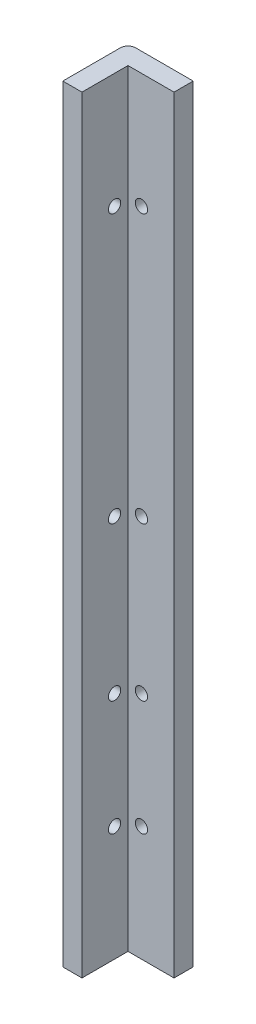
ISO-10303-21;
HEADER;
FILE_DESCRIPTION(('STEP AP214'),'2;1');
FILE_NAME('part.step','',(''),(''),'','','');
FILE_SCHEMA(('AUTOMOTIVE_DESIGN { 1 0 10303 214 1 1 1 1 }'));
ENDSEC;
DATA;
#1=APPLICATION_CONTEXT('core data for automotive mechanical design processes');
#2=APPLICATION_PROTOCOL_DEFINITION('international standard','automotive_design',2000,#1);
#3=PRODUCT_CONTEXT('',#1,'mechanical');
#4=PRODUCT('Part','Part','',(#3));
#5=PRODUCT_RELATED_PRODUCT_CATEGORY('part','',(#4));
#6=PRODUCT_DEFINITION_FORMATION('','',#4);
#7=PRODUCT_DEFINITION_CONTEXT('part definition',#1,'design');
#8=PRODUCT_DEFINITION('design','',#6,#7);
#9=PRODUCT_DEFINITION_SHAPE('','',#8);
#10=(LENGTH_UNIT() NAMED_UNIT(*) SI_UNIT(.MILLI.,.METRE.));
#11=(NAMED_UNIT(*) PLANE_ANGLE_UNIT() SI_UNIT($,.RADIAN.));
#12=(NAMED_UNIT(*) SI_UNIT($,.STERADIAN.) SOLID_ANGLE_UNIT());
#13=UNCERTAINTY_MEASURE_WITH_UNIT(LENGTH_MEASURE(1.E-05),#10,'distance_accuracy_value','');
#14=(GEOMETRIC_REPRESENTATION_CONTEXT(3) GLOBAL_UNCERTAINTY_ASSIGNED_CONTEXT((#13)) GLOBAL_UNIT_ASSIGNED_CONTEXT((#10,
#11,#12)) REPRESENTATION_CONTEXT('',''));
#15=CARTESIAN_POINT('',(0.,0.,0.));
#16=DIRECTION('',(0.,0.,1.));
#17=DIRECTION('',(1.,0.,0.));
#18=AXIS2_PLACEMENT_3D('',#15,#16,#17);
#19=CARTESIAN_POINT('',(0.,100.,0.));
#20=DIRECTION('',(1.,0.,0.));
#21=DIRECTION('',(0.,0.,-1.));
#22=AXIS2_PLACEMENT_3D('',#19,#20,#21);
#23=PLANE('',#22);
#24=CARTESIAN_POINT('',(0.,50.,-4.25));
#25=DIRECTION('',(-1.,0.,0.));
#26=DIRECTION('',(0.,0.,1.));
#27=AXIS2_PLACEMENT_3D('',#24,#25,#26);
#28=CIRCLE('',#27,1.025);
#29=CARTESIAN_POINT('',(0.,50.,-3.225));
#30=VERTEX_POINT('',#29);
#31=EDGE_CURVE('E212',#30,#30,#28,.T.);
#32=ORIENTED_EDGE('',*,*,#31,.F.);
#33=EDGE_LOOP('',(#32));
#34=FACE_BOUND('',#33,.T.);
#35=CARTESIAN_POINT('',(0.,15.,-4.25));
#36=DIRECTION('',(-1.,0.,0.));
#37=DIRECTION('',(0.,0.,1.));
#38=AXIS2_PLACEMENT_3D('',#35,#36,#37);
#39=CIRCLE('',#38,1.025);
#40=CARTESIAN_POINT('',(0.,15.,-3.225));
#41=VERTEX_POINT('',#40);
#42=EDGE_CURVE('E221',#41,#41,#39,.T.);
#43=ORIENTED_EDGE('',*,*,#42,.F.);
#44=EDGE_LOOP('',(#43));
#45=FACE_BOUND('',#44,.T.);
#46=DIRECTION('',(0.,0.,1.));
#47=VECTOR('',#46,1.);
#48=CARTESIAN_POINT('',(0.,0.,0.));
#49=LINE('',#48,#47);
#50=CARTESIAN_POINT('',(0.,0.,-7.49999999999999));
#51=VERTEX_POINT('',#50);
#52=CARTESIAN_POINT('',(0.,0.,0.));
#53=VERTEX_POINT('',#52);
#54=EDGE_CURVE('E92',#51,#53,#49,.T.);
#55=ORIENTED_EDGE('',*,*,#54,.T.);
#56=DIRECTION('',(0.,-1.,0.));
#57=VECTOR('',#56,1.);
#58=CARTESIAN_POINT('',(0.,100.,0.));
#59=LINE('',#58,#57);
#60=CARTESIAN_POINT('',(0.,100.,0.));
#61=VERTEX_POINT('',#60);
#62=EDGE_CURVE('E132',#61,#53,#59,.T.);
#63=ORIENTED_EDGE('',*,*,#62,.F.);
#64=DIRECTION('',(0.,0.,1.));
#65=VECTOR('',#64,1.);
#66=CARTESIAN_POINT('',(0.,100.,0.));
#67=LINE('',#66,#65);
#68=CARTESIAN_POINT('',(0.,100.,-7.49999999999999));
#69=VERTEX_POINT('',#68);
#70=EDGE_CURVE('E60',#69,#61,#67,.T.);
#71=ORIENTED_EDGE('',*,*,#70,.F.);
#72=DIRECTION('',(0.,-1.,0.));
#73=VECTOR('',#72,1.);
#74=CARTESIAN_POINT('',(0.,100.,-7.49999999999999));
#75=LINE('',#74,#73);
#76=EDGE_CURVE('E128',#69,#51,#75,.T.);
#77=ORIENTED_EDGE('',*,*,#76,.T.);
#78=EDGE_LOOP('',(#55,#63,#71,#77));
#79=FACE_BOUND('',#78,.T.);
#80=CARTESIAN_POINT('',(0.,85.,-4.25));
#81=DIRECTION('',(-1.,0.,0.));
#82=DIRECTION('',(0.,0.,1.));
#83=AXIS2_PLACEMENT_3D('',#80,#81,#82);
#84=CIRCLE('',#83,1.025);
#85=CARTESIAN_POINT('',(0.,85.,-3.225));
#86=VERTEX_POINT('',#85);
#87=EDGE_CURVE('E170',#86,#86,#84,.T.);
#88=ORIENTED_EDGE('',*,*,#87,.F.);
#89=EDGE_LOOP('',(#88));
#90=FACE_BOUND('',#89,.T.);
#91=CARTESIAN_POINT('',(0.,30.,-4.25));
#92=DIRECTION('',(-1.,0.,0.));
#93=DIRECTION('',(0.,0.,1.));
#94=AXIS2_PLACEMENT_3D('',#91,#92,#93);
#95=CIRCLE('',#94,1.025);
#96=CARTESIAN_POINT('',(0.,30.,-3.225));
#97=VERTEX_POINT('',#96);
#98=EDGE_CURVE('E193',#97,#97,#95,.T.);
#99=ORIENTED_EDGE('',*,*,#98,.F.);
#100=EDGE_LOOP('',(#99));
#101=FACE_BOUND('',#100,.T.);
#102=ADVANCED_FACE('F43',(#34,#45,#79,#90,#101),#23,.F.);
#103=CARTESIAN_POINT('',(0.,85.,-4.25));
#104=DIRECTION('',(-1.,0.,0.));
#105=DIRECTION('',(0.,0.,1.));
#106=AXIS2_PLACEMENT_3D('',#103,#104,#105);
#107=CONICAL_SURFACE('',#106,1.025,0.78539816339746);
#108=CARTESIAN_POINT('',(0.225000000000003,85.,-4.25));
#109=DIRECTION('',(-1.,0.,0.));
#110=DIRECTION('',(0.,0.,1.));
#111=AXIS2_PLACEMENT_3D('',#108,#109,#110);
#112=CIRCLE('',#111,0.799999999999988);
#113=CARTESIAN_POINT('',(0.225000000000003,85.,-3.45000000000001));
#114=VERTEX_POINT('',#113);
#115=EDGE_CURVE('E11',#114,#114,#112,.T.);
#116=ORIENTED_EDGE('',*,*,#115,.F.);
#117=EDGE_LOOP('',(#116));
#118=FACE_BOUND('',#117,.T.);
#119=ORIENTED_EDGE('',*,*,#87,.T.);
#120=EDGE_LOOP('',(#119));
#121=FACE_BOUND('',#120,.T.);
#122=ADVANCED_FACE('F45',(#118,#121),#107,.F.);
#123=CARTESIAN_POINT('',(0.,85.,-4.25));
#124=DIRECTION('',(-1.,0.,0.));
#125=DIRECTION('',(0.,0.,1.));
#126=AXIS2_PLACEMENT_3D('',#123,#124,#125);
#127=CYLINDRICAL_SURFACE('',#126,0.799999999999993);
#128=CARTESIAN_POINT('',(2.5,85.,-4.25));
#129=DIRECTION('',(-1.,0.,0.));
#130=DIRECTION('',(0.,0.,1.));
#131=AXIS2_PLACEMENT_3D('',#128,#129,#130);
#132=CIRCLE('',#131,0.799999999999993);
#133=CARTESIAN_POINT('',(2.5,85.,-3.45000000000001));
#134=VERTEX_POINT('',#133);
#135=EDGE_CURVE('E52',#134,#134,#132,.T.);
#136=ORIENTED_EDGE('',*,*,#135,.F.);
#137=EDGE_LOOP('',(#136));
#138=FACE_BOUND('',#137,.T.);
#139=ORIENTED_EDGE('',*,*,#115,.T.);
#140=EDGE_LOOP('',(#139));
#141=FACE_BOUND('',#140,.T.);
#142=ADVANCED_FACE('F177',(#138,#141),#127,.F.);
#143=CARTESIAN_POINT('',(4.25,85.,-8.5));
#144=DIRECTION('',(0.,0.,-1.));
#145=DIRECTION('',(-1.,0.,0.));
#146=AXIS2_PLACEMENT_3D('',#143,#144,#145);
#147=CONICAL_SURFACE('',#146,1.025,0.785398163397464);
#148=CARTESIAN_POINT('',(4.25,85.,-8.275));
#149=DIRECTION('',(0.,0.,-1.));
#150=DIRECTION('',(-1.,0.,0.));
#151=AXIS2_PLACEMENT_3D('',#148,#149,#150);
#152=CIRCLE('',#151,0.799999999999988);
#153=CARTESIAN_POINT('',(3.45000000000001,85.,-8.275));
#154=VERTEX_POINT('',#153);
#155=EDGE_CURVE('E167',#154,#154,#152,.T.);
#156=ORIENTED_EDGE('',*,*,#155,.F.);
#157=EDGE_LOOP('',(#156));
#158=FACE_BOUND('',#157,.T.);
#159=CARTESIAN_POINT('',(4.25,85.,-8.5));
#160=DIRECTION('',(0.,0.,-1.));
#161=DIRECTION('',(-1.,0.,0.));
#162=AXIS2_PLACEMENT_3D('',#159,#160,#161);
#163=CIRCLE('',#162,1.025);
#164=CARTESIAN_POINT('',(3.225,85.,-8.5));
#165=VERTEX_POINT('',#164);
#166=EDGE_CURVE('E161',#165,#165,#163,.T.);
#167=ORIENTED_EDGE('',*,*,#166,.T.);
#168=EDGE_LOOP('',(#167));
#169=FACE_BOUND('',#168,.T.);
#170=ADVANCED_FACE('F180',(#158,#169),#147,.F.);
#171=CARTESIAN_POINT('',(4.25,85.,-8.5));
#172=DIRECTION('',(0.,0.,-1.));
#173=DIRECTION('',(-1.,0.,0.));
#174=AXIS2_PLACEMENT_3D('',#171,#172,#173);
#175=CYLINDRICAL_SURFACE('',#174,0.799999999999994);
#176=CARTESIAN_POINT('',(4.25,85.,-6.));
#177=DIRECTION('',(0.,0.,-1.));
#178=DIRECTION('',(-1.,0.,0.));
#179=AXIS2_PLACEMENT_3D('',#176,#177,#178);
#180=CIRCLE('',#179,0.799999999999994);
#181=CARTESIAN_POINT('',(3.45000000000001,85.,-6.));
#182=VERTEX_POINT('',#181);
#183=EDGE_CURVE('E164',#182,#182,#180,.T.);
#184=ORIENTED_EDGE('',*,*,#183,.F.);
#185=EDGE_LOOP('',(#184));
#186=FACE_BOUND('',#185,.T.);
#187=ORIENTED_EDGE('',*,*,#155,.T.);
#188=EDGE_LOOP('',(#187));
#189=FACE_BOUND('',#188,.T.);
#190=ADVANCED_FACE('F280',(#186,#189),#175,.F.);
#191=CARTESIAN_POINT('',(1.00000000000001,100.,-8.5));
#192=DIRECTION('',(0.,0.,1.));
#193=DIRECTION('',(1.,0.,0.));
#194=AXIS2_PLACEMENT_3D('',#191,#192,#193);
#195=PLANE('',#194);
#196=CARTESIAN_POINT('',(4.25,30.,-8.5));
#197=DIRECTION('',(0.,0.,-1.));
#198=DIRECTION('',(-1.,0.,0.));
#199=AXIS2_PLACEMENT_3D('',#196,#197,#198);
#200=CIRCLE('',#199,1.025);
#201=CARTESIAN_POINT('',(3.225,30.,-8.5));
#202=VERTEX_POINT('',#201);
#203=EDGE_CURVE('E203',#202,#202,#200,.T.);
#204=ORIENTED_EDGE('',*,*,#203,.F.);
#205=EDGE_LOOP('',(#204));
#206=FACE_BOUND('',#205,.T.);
#207=CARTESIAN_POINT('',(4.25,50.,-8.5));
#208=DIRECTION('',(0.,0.,-1.));
#209=DIRECTION('',(-1.,0.,0.));
#210=AXIS2_PLACEMENT_3D('',#207,#208,#209);
#211=CIRCLE('',#210,1.025);
#212=CARTESIAN_POINT('',(3.225,50.,-8.5));
#213=VERTEX_POINT('',#212);
#214=EDGE_CURVE('E230',#213,#213,#211,.T.);
#215=ORIENTED_EDGE('',*,*,#214,.F.);
#216=EDGE_LOOP('',(#215));
#217=FACE_BOUND('',#216,.T.);
#218=DIRECTION('',(-1.,0.,0.));
#219=VECTOR('',#218,1.);
#220=CARTESIAN_POINT('',(1.00000000000001,0.,-8.5));
#221=LINE('',#220,#219);
#222=CARTESIAN_POINT('',(8.5,0.,-8.5));
#223=VERTEX_POINT('',#222);
#224=CARTESIAN_POINT('',(1.,0.,-8.5));
#225=VERTEX_POINT('',#224);
#226=EDGE_CURVE('E126',#223,#225,#221,.T.);
#227=ORIENTED_EDGE('',*,*,#226,.T.);
#228=DIRECTION('',(0.,-1.,0.));
#229=VECTOR('',#228,1.);
#230=CARTESIAN_POINT('',(1.,100.,-8.5));
#231=LINE('',#230,#229);
#232=CARTESIAN_POINT('',(1.,100.,-8.5));
#233=VERTEX_POINT('',#232);
#234=EDGE_CURVE('E122',#233,#225,#231,.T.);
#235=ORIENTED_EDGE('',*,*,#234,.F.);
#236=DIRECTION('',(-1.,0.,0.));
#237=VECTOR('',#236,1.);
#238=CARTESIAN_POINT('',(1.00000000000001,100.,-8.5));
#239=LINE('',#238,#237);
#240=CARTESIAN_POINT('',(8.5,100.,-8.5));
#241=VERTEX_POINT('',#240);
#242=EDGE_CURVE('E111',#241,#233,#239,.T.);
#243=ORIENTED_EDGE('',*,*,#242,.F.);
#244=DIRECTION('',(0.,-1.,0.));
#245=VECTOR('',#244,1.);
#246=CARTESIAN_POINT('',(8.5,100.,-8.5));
#247=LINE('',#246,#245);
#248=EDGE_CURVE('E127',#241,#223,#247,.T.);
#249=ORIENTED_EDGE('',*,*,#248,.T.);
#250=EDGE_LOOP('',(#227,#235,#243,#249));
#251=FACE_BOUND('',#250,.T.);
#252=CARTESIAN_POINT('',(4.25,15.,-8.5));
#253=DIRECTION('',(0.,0.,-1.));
#254=DIRECTION('',(-1.,0.,0.));
#255=AXIS2_PLACEMENT_3D('',#252,#253,#254);
#256=CIRCLE('',#255,1.025);
#257=CARTESIAN_POINT('',(3.225,15.,-8.5));
#258=VERTEX_POINT('',#257);
#259=EDGE_CURVE('E239',#258,#258,#256,.T.);
#260=ORIENTED_EDGE('',*,*,#259,.F.);
#261=EDGE_LOOP('',(#260));
#262=FACE_BOUND('',#261,.T.);
#263=ORIENTED_EDGE('',*,*,#166,.F.);
#264=EDGE_LOOP('',(#263));
#265=FACE_BOUND('',#264,.T.);
#266=ADVANCED_FACE('F123',(#206,#217,#251,#262,#265),#195,.F.);
#267=CARTESIAN_POINT('',(2.5,100.,0.));
#268=DIRECTION('',(0.,0.,-1.));
#269=DIRECTION('',(-1.,0.,0.));
#270=AXIS2_PLACEMENT_3D('',#267,#268,#269);
#271=PLANE('',#270);
#272=DIRECTION('',(1.,0.,0.));
#273=VECTOR('',#272,1.);
#274=CARTESIAN_POINT('',(2.5,0.,0.));
#275=LINE('',#274,#273);
#276=CARTESIAN_POINT('',(2.5,0.,0.));
#277=VERTEX_POINT('',#276);
#278=EDGE_CURVE('E136',#53,#277,#275,.T.);
#279=ORIENTED_EDGE('',*,*,#278,.T.);
#280=DIRECTION('',(0.,-1.,0.));
#281=VECTOR('',#280,1.);
#282=CARTESIAN_POINT('',(2.5,100.,0.));
#283=LINE('',#282,#281);
#284=CARTESIAN_POINT('',(2.5,100.,0.));
#285=VERTEX_POINT('',#284);
#286=EDGE_CURVE('E159',#285,#277,#283,.T.);
#287=ORIENTED_EDGE('',*,*,#286,.F.);
#288=DIRECTION('',(1.,0.,0.));
#289=VECTOR('',#288,1.);
#290=CARTESIAN_POINT('',(2.5,100.,0.));
#291=LINE('',#290,#289);
#292=EDGE_CURVE('E149',#61,#285,#291,.T.);
#293=ORIENTED_EDGE('',*,*,#292,.F.);
#294=ORIENTED_EDGE('',*,*,#62,.T.);
#295=EDGE_LOOP('',(#279,#287,#293,#294));
#296=FACE_BOUND('',#295,.T.);
#297=ADVANCED_FACE('F264',(#296),#271,.F.);
#298=CARTESIAN_POINT('',(2.5,100.,-6.));
#299=DIRECTION('',(-1.,0.,0.));
#300=DIRECTION('',(0.,0.,1.));
#301=AXIS2_PLACEMENT_3D('',#298,#299,#300);
#302=PLANE('',#301);
#303=CARTESIAN_POINT('',(2.5,30.,-4.25));
#304=DIRECTION('',(-1.,0.,0.));
#305=DIRECTION('',(0.,0.,1.));
#306=AXIS2_PLACEMENT_3D('',#303,#304,#305);
#307=CIRCLE('',#306,0.799999999999993);
#308=CARTESIAN_POINT('',(2.5,30.,-3.45000000000001));
#309=VERTEX_POINT('',#308);
#310=EDGE_CURVE('E198',#309,#309,#307,.T.);
#311=ORIENTED_EDGE('',*,*,#310,.T.);
#312=EDGE_LOOP('',(#311));
#313=FACE_BOUND('',#312,.T.);
#314=CARTESIAN_POINT('',(2.5,50.,-4.25));
#315=DIRECTION('',(-1.,0.,0.));
#316=DIRECTION('',(0.,0.,1.));
#317=AXIS2_PLACEMENT_3D('',#314,#315,#316);
#318=CIRCLE('',#317,0.799999999999993);
#319=CARTESIAN_POINT('',(2.5,50.,-3.45000000000001));
#320=VERTEX_POINT('',#319);
#321=EDGE_CURVE('E215',#320,#320,#318,.T.);
#322=ORIENTED_EDGE('',*,*,#321,.T.);
#323=EDGE_LOOP('',(#322));
#324=FACE_BOUND('',#323,.T.);
#325=CARTESIAN_POINT('',(2.5,15.,-4.25));
#326=DIRECTION('',(-1.,0.,0.));
#327=DIRECTION('',(0.,0.,1.));
#328=AXIS2_PLACEMENT_3D('',#325,#326,#327);
#329=CIRCLE('',#328,0.799999999999993);
#330=CARTESIAN_POINT('',(2.5,15.,-3.45000000000001));
#331=VERTEX_POINT('',#330);
#332=EDGE_CURVE('E227',#331,#331,#329,.T.);
#333=ORIENTED_EDGE('',*,*,#332,.T.);
#334=EDGE_LOOP('',(#333));
#335=FACE_BOUND('',#334,.T.);
#336=DIRECTION('',(0.,0.,-1.));
#337=VECTOR('',#336,1.);
#338=CARTESIAN_POINT('',(2.5,0.,-6.));
#339=LINE('',#338,#337);
#340=CARTESIAN_POINT('',(2.5,0.,-6.));
#341=VERTEX_POINT('',#340);
#342=EDGE_CURVE('E139',#277,#341,#339,.T.);
#343=ORIENTED_EDGE('',*,*,#342,.T.);
#344=DIRECTION('',(0.,-1.,0.));
#345=VECTOR('',#344,1.);
#346=CARTESIAN_POINT('',(2.5,100.,-6.));
#347=LINE('',#346,#345);
#348=CARTESIAN_POINT('',(2.5,100.,-6.));
#349=VERTEX_POINT('',#348);
#350=EDGE_CURVE('E156',#349,#341,#347,.T.);
#351=ORIENTED_EDGE('',*,*,#350,.F.);
#352=DIRECTION('',(0.,0.,-1.));
#353=VECTOR('',#352,1.);
#354=CARTESIAN_POINT('',(2.5,100.,-6.));
#355=LINE('',#354,#353);
#356=EDGE_CURVE('E101',#285,#349,#355,.T.);
#357=ORIENTED_EDGE('',*,*,#356,.F.);
#358=ORIENTED_EDGE('',*,*,#286,.T.);
#359=EDGE_LOOP('',(#343,#351,#357,#358));
#360=FACE_BOUND('',#359,.T.);
#361=ORIENTED_EDGE('',*,*,#135,.T.);
#362=EDGE_LOOP('',(#361));
#363=FACE_BOUND('',#362,.T.);
#364=ADVANCED_FACE('F175',(#313,#324,#335,#360,#363),#302,.F.);
#365=CARTESIAN_POINT('',(8.5,100.,-6.));
#366=DIRECTION('',(0.,0.,-1.));
#367=DIRECTION('',(-1.,0.,0.));
#368=AXIS2_PLACEMENT_3D('',#365,#366,#367);
#369=PLANE('',#368);
#370=CARTESIAN_POINT('',(4.25,30.,-6.));
#371=DIRECTION('',(0.,0.,-1.));
#372=DIRECTION('',(-1.,0.,0.));
#373=AXIS2_PLACEMENT_3D('',#370,#371,#372);
#374=CIRCLE('',#373,0.799999999999999);
#375=CARTESIAN_POINT('',(3.45,30.,-6.));
#376=VERTEX_POINT('',#375);
#377=EDGE_CURVE('E209',#376,#376,#374,.T.);
#378=ORIENTED_EDGE('',*,*,#377,.T.);
#379=EDGE_LOOP('',(#378));
#380=FACE_BOUND('',#379,.T.);
#381=CARTESIAN_POINT('',(4.25,50.,-6.));
#382=DIRECTION('',(0.,0.,-1.));
#383=DIRECTION('',(-1.,0.,0.));
#384=AXIS2_PLACEMENT_3D('',#381,#382,#383);
#385=CIRCLE('',#384,0.799999999999994);
#386=CARTESIAN_POINT('',(3.45000000000001,50.,-6.));
#387=VERTEX_POINT('',#386);
#388=EDGE_CURVE('E233',#387,#387,#385,.T.);
#389=ORIENTED_EDGE('',*,*,#388,.T.);
#390=EDGE_LOOP('',(#389));
#391=FACE_BOUND('',#390,.T.);
#392=CARTESIAN_POINT('',(4.25,15.,-6.));
#393=DIRECTION('',(0.,0.,-1.));
#394=DIRECTION('',(-1.,0.,0.));
#395=AXIS2_PLACEMENT_3D('',#392,#393,#394);
#396=CIRCLE('',#395,0.799999999999994);
#397=CARTESIAN_POINT('',(3.45000000000001,15.,-6.));
#398=VERTEX_POINT('',#397);
#399=EDGE_CURVE('E140',#398,#398,#396,.T.);
#400=ORIENTED_EDGE('',*,*,#399,.T.);
#401=EDGE_LOOP('',(#400));
#402=FACE_BOUND('',#401,.T.);
#403=DIRECTION('',(1.,0.,0.));
#404=VECTOR('',#403,1.);
#405=CARTESIAN_POINT('',(8.5,0.,-6.));
#406=LINE('',#405,#404);
#407=CARTESIAN_POINT('',(8.5,0.,-6.));
#408=VERTEX_POINT('',#407);
#409=EDGE_CURVE('E142',#341,#408,#406,.T.);
#410=ORIENTED_EDGE('',*,*,#409,.T.);
#411=DIRECTION('',(0.,-1.,0.));
#412=VECTOR('',#411,1.);
#413=CARTESIAN_POINT('',(8.5,100.,-6.));
#414=LINE('',#413,#412);
#415=CARTESIAN_POINT('',(8.5,100.,-6.));
#416=VERTEX_POINT('',#415);
#417=EDGE_CURVE('E153',#416,#408,#414,.T.);
#418=ORIENTED_EDGE('',*,*,#417,.F.);
#419=DIRECTION('',(1.,0.,0.));
#420=VECTOR('',#419,1.);
#421=CARTESIAN_POINT('',(8.5,100.,-6.));
#422=LINE('',#421,#420);
#423=EDGE_CURVE('E249',#349,#416,#422,.T.);
#424=ORIENTED_EDGE('',*,*,#423,.F.);
#425=ORIENTED_EDGE('',*,*,#350,.T.);
#426=EDGE_LOOP('',(#410,#418,#424,#425));
#427=FACE_BOUND('',#426,.T.);
#428=ORIENTED_EDGE('',*,*,#183,.T.);
#429=EDGE_LOOP('',(#428));
#430=FACE_BOUND('',#429,.T.);
#431=ADVANCED_FACE('F253',(#380,#391,#402,#427,#430),#369,.F.);
#432=CARTESIAN_POINT('',(8.5,100.,-8.5));
#433=DIRECTION('',(-1.,0.,0.));
#434=DIRECTION('',(0.,0.,1.));
#435=AXIS2_PLACEMENT_3D('',#432,#433,#434);
#436=PLANE('',#435);
#437=DIRECTION('',(0.,0.,-1.));
#438=VECTOR('',#437,1.);
#439=CARTESIAN_POINT('',(8.5,0.,-8.5));
#440=LINE('',#439,#438);
#441=EDGE_CURVE('E144',#408,#223,#440,.T.);
#442=ORIENTED_EDGE('',*,*,#441,.T.);
#443=ORIENTED_EDGE('',*,*,#248,.F.);
#444=DIRECTION('',(0.,0.,-1.));
#445=VECTOR('',#444,1.);
#446=CARTESIAN_POINT('',(8.5,100.,-8.5));
#447=LINE('',#446,#445);
#448=EDGE_CURVE('E117',#416,#241,#447,.T.);
#449=ORIENTED_EDGE('',*,*,#448,.F.);
#450=ORIENTED_EDGE('',*,*,#417,.T.);
#451=EDGE_LOOP('',(#442,#443,#449,#450));
#452=FACE_BOUND('',#451,.T.);
#453=ADVANCED_FACE('F258',(#452),#436,.F.);
#454=CARTESIAN_POINT('',(1.,100.,-7.5));
#455=DIRECTION('',(0.,-1.,0.));
#456=DIRECTION('',(0.,0.,-1.));
#457=AXIS2_PLACEMENT_3D('',#454,#455,#456);
#458=CYLINDRICAL_SURFACE('',#457,1.);
#459=CARTESIAN_POINT('',(1.,0.,-7.5));
#460=DIRECTION('',(0.,1.,0.));
#461=DIRECTION('',(0.,0.,-1.));
#462=AXIS2_PLACEMENT_3D('',#459,#460,#461);
#463=CIRCLE('',#462,1.);
#464=EDGE_CURVE('E86',#225,#51,#463,.T.);
#465=ORIENTED_EDGE('',*,*,#464,.T.);
#466=ORIENTED_EDGE('',*,*,#76,.F.);
#467=CARTESIAN_POINT('',(1.,100.,-7.5));
#468=DIRECTION('',(0.,1.,0.));
#469=DIRECTION('',(0.,0.,-1.));
#470=AXIS2_PLACEMENT_3D('',#467,#468,#469);
#471=CIRCLE('',#470,1.);
#472=EDGE_CURVE('E115',#233,#69,#471,.T.);
#473=ORIENTED_EDGE('',*,*,#472,.F.);
#474=ORIENTED_EDGE('',*,*,#234,.T.);
#475=EDGE_LOOP('',(#465,#466,#473,#474));
#476=FACE_BOUND('',#475,.T.);
#477=ADVANCED_FACE('F130',(#476),#458,.T.);
#478=CARTESIAN_POINT('',(1.,100.,-7.5));
#479=DIRECTION('',(0.,-1.,0.));
#480=DIRECTION('',(0.,0.,-1.));
#481=AXIS2_PLACEMENT_3D('',#478,#479,#480);
#482=PLANE('',#481);
#483=ORIENTED_EDGE('',*,*,#292,.T.);
#484=ORIENTED_EDGE('',*,*,#356,.T.);
#485=ORIENTED_EDGE('',*,*,#423,.T.);
#486=ORIENTED_EDGE('',*,*,#448,.T.);
#487=ORIENTED_EDGE('',*,*,#242,.T.);
#488=ORIENTED_EDGE('',*,*,#472,.T.);
#489=ORIENTED_EDGE('',*,*,#70,.T.);
#490=EDGE_LOOP('',(#483,#484,#485,#486,#487,#488,#489));
#491=FACE_BOUND('',#490,.T.);
#492=ADVANCED_FACE('F113',(#491),#482,.F.);
#493=CARTESIAN_POINT('',(1.,0.,-7.5));
#494=DIRECTION('',(0.,-1.,0.));
#495=DIRECTION('',(0.,0.,-1.));
#496=AXIS2_PLACEMENT_3D('',#493,#494,#495);
#497=PLANE('',#496);
#498=ORIENTED_EDGE('',*,*,#278,.F.);
#499=ORIENTED_EDGE('',*,*,#54,.F.);
#500=ORIENTED_EDGE('',*,*,#464,.F.);
#501=ORIENTED_EDGE('',*,*,#226,.F.);
#502=ORIENTED_EDGE('',*,*,#441,.F.);
#503=ORIENTED_EDGE('',*,*,#409,.F.);
#504=ORIENTED_EDGE('',*,*,#342,.F.);
#505=EDGE_LOOP('',(#498,#499,#500,#501,#502,#503,#504));
#506=FACE_BOUND('',#505,.T.);
#507=ADVANCED_FACE('F261',(#506),#497,.T.);
#508=CARTESIAN_POINT('',(4.25,15.,-8.5));
#509=DIRECTION('',(0.,0.,-1.));
#510=DIRECTION('',(-1.,0.,0.));
#511=AXIS2_PLACEMENT_3D('',#508,#509,#510);
#512=CYLINDRICAL_SURFACE('',#511,0.799999999999994);
#513=ORIENTED_EDGE('',*,*,#399,.F.);
#514=EDGE_LOOP('',(#513));
#515=FACE_BOUND('',#514,.T.);
#516=CARTESIAN_POINT('',(4.25,15.,-8.275));
#517=DIRECTION('',(0.,0.,-1.));
#518=DIRECTION('',(-1.,0.,0.));
#519=AXIS2_PLACEMENT_3D('',#516,#517,#518);
#520=CIRCLE('',#519,0.799999999999988);
#521=CARTESIAN_POINT('',(3.45000000000001,15.,-8.275));
#522=VERTEX_POINT('',#521);
#523=EDGE_CURVE('E242',#522,#522,#520,.T.);
#524=ORIENTED_EDGE('',*,*,#523,.T.);
#525=EDGE_LOOP('',(#524));
#526=FACE_BOUND('',#525,.T.);
#527=ADVANCED_FACE('F314',(#515,#526),#512,.F.);
#528=CARTESIAN_POINT('',(4.25,15.,-8.5));
#529=DIRECTION('',(0.,0.,-1.));
#530=DIRECTION('',(-1.,0.,0.));
#531=AXIS2_PLACEMENT_3D('',#528,#529,#530);
#532=CONICAL_SURFACE('',#531,1.025,0.785398163397464);
#533=ORIENTED_EDGE('',*,*,#523,.F.);
#534=EDGE_LOOP('',(#533));
#535=FACE_BOUND('',#534,.T.);
#536=ORIENTED_EDGE('',*,*,#259,.T.);
#537=EDGE_LOOP('',(#536));
#538=FACE_BOUND('',#537,.T.);
#539=ADVANCED_FACE('F318',(#535,#538),#532,.F.);
#540=CARTESIAN_POINT('',(4.25,50.,-8.5));
#541=DIRECTION('',(0.,0.,-1.));
#542=DIRECTION('',(-1.,0.,0.));
#543=AXIS2_PLACEMENT_3D('',#540,#541,#542);
#544=CYLINDRICAL_SURFACE('',#543,0.799999999999994);
#545=ORIENTED_EDGE('',*,*,#388,.F.);
#546=EDGE_LOOP('',(#545));
#547=FACE_BOUND('',#546,.T.);
#548=CARTESIAN_POINT('',(4.25,50.,-8.275));
#549=DIRECTION('',(0.,0.,-1.));
#550=DIRECTION('',(-1.,0.,0.));
#551=AXIS2_PLACEMENT_3D('',#548,#549,#550);
#552=CIRCLE('',#551,0.799999999999988);
#553=CARTESIAN_POINT('',(3.45000000000001,50.,-8.275));
#554=VERTEX_POINT('',#553);
#555=EDGE_CURVE('E236',#554,#554,#552,.T.);
#556=ORIENTED_EDGE('',*,*,#555,.T.);
#557=EDGE_LOOP('',(#556));
#558=FACE_BOUND('',#557,.T.);
#559=ADVANCED_FACE('F322',(#547,#558),#544,.F.);
#560=CARTESIAN_POINT('',(4.25,50.,-8.5));
#561=DIRECTION('',(0.,0.,-1.));
#562=DIRECTION('',(-1.,0.,0.));
#563=AXIS2_PLACEMENT_3D('',#560,#561,#562);
#564=CONICAL_SURFACE('',#563,1.025,0.785398163397464);
#565=ORIENTED_EDGE('',*,*,#555,.F.);
#566=EDGE_LOOP('',(#565));
#567=FACE_BOUND('',#566,.T.);
#568=ORIENTED_EDGE('',*,*,#214,.T.);
#569=EDGE_LOOP('',(#568));
#570=FACE_BOUND('',#569,.T.);
#571=ADVANCED_FACE('F326',(#567,#570),#564,.F.);
#572=CARTESIAN_POINT('',(0.,15.,-4.25));
#573=DIRECTION('',(-1.,0.,0.));
#574=DIRECTION('',(0.,0.,1.));
#575=AXIS2_PLACEMENT_3D('',#572,#573,#574);
#576=CYLINDRICAL_SURFACE('',#575,0.799999999999993);
#577=ORIENTED_EDGE('',*,*,#332,.F.);
#578=EDGE_LOOP('',(#577));
#579=FACE_BOUND('',#578,.T.);
#580=CARTESIAN_POINT('',(0.225000000000003,15.,-4.25));
#581=DIRECTION('',(-1.,0.,0.));
#582=DIRECTION('',(0.,0.,1.));
#583=AXIS2_PLACEMENT_3D('',#580,#581,#582);
#584=CIRCLE('',#583,0.799999999999988);
#585=CARTESIAN_POINT('',(0.225000000000003,15.,-3.45000000000001));
#586=VERTEX_POINT('',#585);
#587=EDGE_CURVE('E224',#586,#586,#584,.T.);
#588=ORIENTED_EDGE('',*,*,#587,.T.);
#589=EDGE_LOOP('',(#588));
#590=FACE_BOUND('',#589,.T.);
#591=ADVANCED_FACE('F330',(#579,#590),#576,.F.);
#592=CARTESIAN_POINT('',(0.,15.,-4.25));
#593=DIRECTION('',(-1.,0.,0.));
#594=DIRECTION('',(0.,0.,1.));
#595=AXIS2_PLACEMENT_3D('',#592,#593,#594);
#596=CONICAL_SURFACE('',#595,1.025,0.78539816339746);
#597=ORIENTED_EDGE('',*,*,#587,.F.);
#598=EDGE_LOOP('',(#597));
#599=FACE_BOUND('',#598,.T.);
#600=ORIENTED_EDGE('',*,*,#42,.T.);
#601=EDGE_LOOP('',(#600));
#602=FACE_BOUND('',#601,.T.);
#603=ADVANCED_FACE('F334',(#599,#602),#596,.F.);
#604=CARTESIAN_POINT('',(0.,50.,-4.25));
#605=DIRECTION('',(-1.,0.,0.));
#606=DIRECTION('',(0.,0.,1.));
#607=AXIS2_PLACEMENT_3D('',#604,#605,#606);
#608=CYLINDRICAL_SURFACE('',#607,0.799999999999993);
#609=ORIENTED_EDGE('',*,*,#321,.F.);
#610=EDGE_LOOP('',(#609));
#611=FACE_BOUND('',#610,.T.);
#612=CARTESIAN_POINT('',(0.225000000000003,50.,-4.25));
#613=DIRECTION('',(-1.,0.,0.));
#614=DIRECTION('',(0.,0.,1.));
#615=AXIS2_PLACEMENT_3D('',#612,#613,#614);
#616=CIRCLE('',#615,0.799999999999988);
#617=CARTESIAN_POINT('',(0.225000000000003,50.,-3.45000000000001));
#618=VERTEX_POINT('',#617);
#619=EDGE_CURVE('E218',#618,#618,#616,.T.);
#620=ORIENTED_EDGE('',*,*,#619,.T.);
#621=EDGE_LOOP('',(#620));
#622=FACE_BOUND('',#621,.T.);
#623=ADVANCED_FACE('F338',(#611,#622),#608,.F.);
#624=CARTESIAN_POINT('',(0.,50.,-4.25));
#625=DIRECTION('',(-1.,0.,0.));
#626=DIRECTION('',(0.,0.,1.));
#627=AXIS2_PLACEMENT_3D('',#624,#625,#626);
#628=CONICAL_SURFACE('',#627,1.025,0.78539816339746);
#629=ORIENTED_EDGE('',*,*,#619,.F.);
#630=EDGE_LOOP('',(#629));
#631=FACE_BOUND('',#630,.T.);
#632=ORIENTED_EDGE('',*,*,#31,.T.);
#633=EDGE_LOOP('',(#632));
#634=FACE_BOUND('',#633,.T.);
#635=ADVANCED_FACE('F342',(#631,#634),#628,.F.);
#636=CARTESIAN_POINT('',(4.25,30.,-8.5));
#637=DIRECTION('',(0.,0.,-1.));
#638=DIRECTION('',(-1.,0.,0.));
#639=AXIS2_PLACEMENT_3D('',#636,#637,#638);
#640=CYLINDRICAL_SURFACE('',#639,0.799999999999999);
#641=ORIENTED_EDGE('',*,*,#377,.F.);
#642=EDGE_LOOP('',(#641));
#643=FACE_BOUND('',#642,.T.);
#644=CARTESIAN_POINT('',(4.25,30.,-8.275));
#645=DIRECTION('',(0.,0.,-1.));
#646=DIRECTION('',(-1.,0.,0.));
#647=AXIS2_PLACEMENT_3D('',#644,#645,#646);
#648=CIRCLE('',#647,0.799999999999999);
#649=CARTESIAN_POINT('',(3.45,30.,-8.275));
#650=VERTEX_POINT('',#649);
#651=EDGE_CURVE('E206',#650,#650,#648,.T.);
#652=ORIENTED_EDGE('',*,*,#651,.T.);
#653=EDGE_LOOP('',(#652));
#654=FACE_BOUND('',#653,.T.);
#655=ADVANCED_FACE('F346',(#643,#654),#640,.F.);
#656=CARTESIAN_POINT('',(4.25,30.,-8.5));
#657=DIRECTION('',(0.,0.,-1.));
#658=DIRECTION('',(-1.,0.,0.));
#659=AXIS2_PLACEMENT_3D('',#656,#657,#658);
#660=CONICAL_SURFACE('',#659,1.025,0.78539816339745);
#661=ORIENTED_EDGE('',*,*,#651,.F.);
#662=EDGE_LOOP('',(#661));
#663=FACE_BOUND('',#662,.T.);
#664=ORIENTED_EDGE('',*,*,#203,.T.);
#665=EDGE_LOOP('',(#664));
#666=FACE_BOUND('',#665,.T.);
#667=ADVANCED_FACE('F350',(#663,#666),#660,.F.);
#668=CARTESIAN_POINT('',(0.,30.,-4.25));
#669=DIRECTION('',(-1.,0.,0.));
#670=DIRECTION('',(0.,0.,1.));
#671=AXIS2_PLACEMENT_3D('',#668,#669,#670);
#672=CYLINDRICAL_SURFACE('',#671,0.799999999999993);
#673=ORIENTED_EDGE('',*,*,#310,.F.);
#674=EDGE_LOOP('',(#673));
#675=FACE_BOUND('',#674,.T.);
#676=CARTESIAN_POINT('',(0.225000000000003,30.,-4.25));
#677=DIRECTION('',(-1.,0.,0.));
#678=DIRECTION('',(0.,0.,1.));
#679=AXIS2_PLACEMENT_3D('',#676,#677,#678);
#680=CIRCLE('',#679,0.799999999999988);
#681=CARTESIAN_POINT('',(0.225000000000003,30.,-3.45000000000001));
#682=VERTEX_POINT('',#681);
#683=EDGE_CURVE('E195',#682,#682,#680,.T.);
#684=ORIENTED_EDGE('',*,*,#683,.T.);
#685=EDGE_LOOP('',(#684));
#686=FACE_BOUND('',#685,.T.);
#687=ADVANCED_FACE('F354',(#675,#686),#672,.F.);
#688=CARTESIAN_POINT('',(0.,30.,-4.25));
#689=DIRECTION('',(-1.,0.,0.));
#690=DIRECTION('',(0.,0.,1.));
#691=AXIS2_PLACEMENT_3D('',#688,#689,#690);
#692=CONICAL_SURFACE('',#691,1.025,0.78539816339746);
#693=ORIENTED_EDGE('',*,*,#683,.F.);
#694=EDGE_LOOP('',(#693));
#695=FACE_BOUND('',#694,.T.);
#696=ORIENTED_EDGE('',*,*,#98,.T.);
#697=EDGE_LOOP('',(#696));
#698=FACE_BOUND('',#697,.T.);
#699=ADVANCED_FACE('F358',(#695,#698),#692,.F.);
#700=CLOSED_SHELL('',(#102,#122,#142,#170,#190,#266,#297,#364,#431,#453,#477,#492,#507,#527,
#539,#559,#571,#591,#603,#623,#635,#655,#667,#687,#699));
#701=MANIFOLD_SOLID_BREP('B2',#700);
#702=ADVANCED_BREP_SHAPE_REPRESENTATION('',(#18,#701),#14);
#703=SHAPE_DEFINITION_REPRESENTATION(#9,#702);
ENDSEC;
END-ISO-10303-21;
